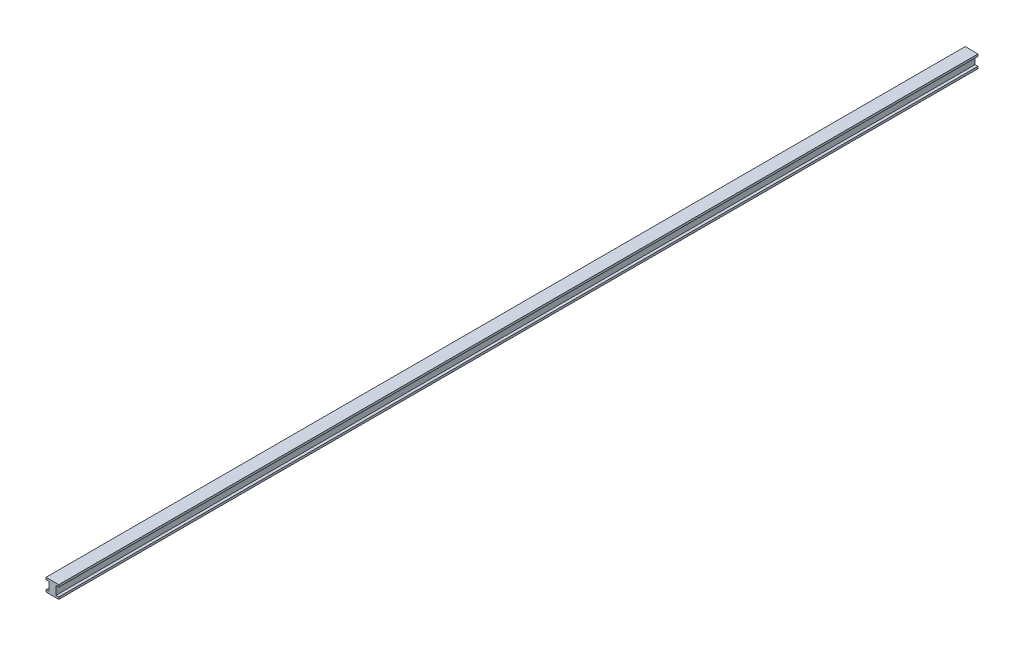
ISO-10303-21;
HEADER;
FILE_DESCRIPTION(('STEP AP214'),'2;1');
FILE_NAME('part.step','',(''),(''),'','','');
FILE_SCHEMA(('AUTOMOTIVE_DESIGN { 1 0 10303 214 1 1 1 1 }'));
ENDSEC;
DATA;
#1=APPLICATION_CONTEXT('core data for automotive mechanical design processes');
#2=APPLICATION_PROTOCOL_DEFINITION('international standard','automotive_design',2000,#1);
#3=PRODUCT_CONTEXT('',#1,'mechanical');
#4=PRODUCT('Part','Part','',(#3));
#5=PRODUCT_RELATED_PRODUCT_CATEGORY('part','',(#4));
#6=PRODUCT_DEFINITION_FORMATION('','',#4);
#7=PRODUCT_DEFINITION_CONTEXT('part definition',#1,'design');
#8=PRODUCT_DEFINITION('design','',#6,#7);
#9=PRODUCT_DEFINITION_SHAPE('','',#8);
#10=(LENGTH_UNIT() NAMED_UNIT(*) SI_UNIT(.MILLI.,.METRE.));
#11=(NAMED_UNIT(*) PLANE_ANGLE_UNIT() SI_UNIT($,.RADIAN.));
#12=(NAMED_UNIT(*) SI_UNIT($,.STERADIAN.) SOLID_ANGLE_UNIT());
#13=UNCERTAINTY_MEASURE_WITH_UNIT(LENGTH_MEASURE(1.E-05),#10,'distance_accuracy_value','');
#14=(GEOMETRIC_REPRESENTATION_CONTEXT(3) GLOBAL_UNCERTAINTY_ASSIGNED_CONTEXT((#13)) GLOBAL_UNIT_ASSIGNED_CONTEXT((#10,
#11,#12)) REPRESENTATION_CONTEXT('',''));
#15=CARTESIAN_POINT('',(0.,0.,0.));
#16=DIRECTION('',(0.,0.,1.));
#17=DIRECTION('',(1.,0.,0.));
#18=AXIS2_PLACEMENT_3D('',#15,#16,#17);
#19=CARTESIAN_POINT('',(-9.,-9.,646.904));
#20=DIRECTION('',(0.,1.,0.));
#21=DIRECTION('',(0.,0.,1.));
#22=AXIS2_PLACEMENT_3D('',#19,#20,#21);
#23=PLANE('',#22);
#24=DIRECTION('',(0.,0.,-1.));
#25=VECTOR('',#24,1.);
#26=CARTESIAN_POINT('',(-9.,-9.,646.904));
#27=LINE('',#26,#25);
#28=CARTESIAN_POINT('',(-9.,-9.,646.904));
#29=VERTEX_POINT('',#28);
#30=CARTESIAN_POINT('',(-9.,-9.,-646.904));
#31=VERTEX_POINT('',#30);
#32=EDGE_CURVE('E138',#29,#31,#27,.T.);
#33=ORIENTED_EDGE('',*,*,#32,.T.);
#34=DIRECTION('',(1.,0.,0.));
#35=VECTOR('',#34,1.);
#36=CARTESIAN_POINT('',(-9.,-9.,-646.904));
#37=LINE('',#36,#35);
#38=CARTESIAN_POINT('',(9.,-9.,-646.904));
#39=VERTEX_POINT('',#38);
#40=EDGE_CURVE('E133',#31,#39,#37,.T.);
#41=ORIENTED_EDGE('',*,*,#40,.T.);
#42=DIRECTION('',(0.,0.,-1.));
#43=VECTOR('',#42,1.);
#44=CARTESIAN_POINT('',(9.,-9.,646.904));
#45=LINE('',#44,#43);
#46=CARTESIAN_POINT('',(9.,-9.,646.904));
#47=VERTEX_POINT('',#46);
#48=EDGE_CURVE('E11',#47,#39,#45,.T.);
#49=ORIENTED_EDGE('',*,*,#48,.F.);
#50=DIRECTION('',(1.,0.,0.));
#51=VECTOR('',#50,1.);
#52=CARTESIAN_POINT('',(-9.,-9.,646.904));
#53=LINE('',#52,#51);
#54=EDGE_CURVE('E169',#29,#47,#53,.T.);
#55=ORIENTED_EDGE('',*,*,#54,.F.);
#56=EDGE_LOOP('',(#33,#41,#49,#55));
#57=FACE_BOUND('',#56,.T.);
#58=ADVANCED_FACE('F33',(#57),#23,.F.);
#59=CARTESIAN_POINT('',(9.,-6.00000000000001,646.904));
#60=DIRECTION('',(-1.,0.,0.));
#61=DIRECTION('',(0.,0.,1.));
#62=AXIS2_PLACEMENT_3D('',#59,#60,#61);
#63=PLANE('',#62);
#64=ORIENTED_EDGE('',*,*,#48,.T.);
#65=DIRECTION('',(0.,1.,0.));
#66=VECTOR('',#65,1.);
#67=CARTESIAN_POINT('',(9.,-6.00000000000001,-646.904));
#68=LINE('',#67,#66);
#69=CARTESIAN_POINT('',(9.,-6.00000000000001,-646.904));
#70=VERTEX_POINT('',#69);
#71=EDGE_CURVE('E123',#39,#70,#68,.T.);
#72=ORIENTED_EDGE('',*,*,#71,.T.);
#73=DIRECTION('',(0.,0.,-1.));
#74=VECTOR('',#73,1.);
#75=CARTESIAN_POINT('',(9.,-6.00000000000001,646.904));
#76=LINE('',#75,#74);
#77=CARTESIAN_POINT('',(9.,-6.00000000000001,646.904));
#78=VERTEX_POINT('',#77);
#79=EDGE_CURVE('E40',#78,#70,#76,.T.);
#80=ORIENTED_EDGE('',*,*,#79,.F.);
#81=DIRECTION('',(0.,1.,0.));
#82=VECTOR('',#81,1.);
#83=CARTESIAN_POINT('',(9.,-6.00000000000001,646.904));
#84=LINE('',#83,#82);
#85=EDGE_CURVE('E124',#47,#78,#84,.T.);
#86=ORIENTED_EDGE('',*,*,#85,.F.);
#87=EDGE_LOOP('',(#64,#72,#80,#86));
#88=FACE_BOUND('',#87,.T.);
#89=ADVANCED_FACE('F121',(#88),#63,.F.);
#90=CARTESIAN_POINT('',(5.,-6.00000000000001,646.904));
#91=DIRECTION('',(0.,-1.,0.));
#92=DIRECTION('',(0.,0.,-1.));
#93=AXIS2_PLACEMENT_3D('',#90,#91,#92);
#94=PLANE('',#93);
#95=ORIENTED_EDGE('',*,*,#79,.T.);
#96=DIRECTION('',(-1.,0.,0.));
#97=VECTOR('',#96,1.);
#98=CARTESIAN_POINT('',(5.,-6.00000000000001,-646.904));
#99=LINE('',#98,#97);
#100=CARTESIAN_POINT('',(5.,-6.00000000000001,-646.904));
#101=VERTEX_POINT('',#100);
#102=EDGE_CURVE('E136',#70,#101,#99,.T.);
#103=ORIENTED_EDGE('',*,*,#102,.T.);
#104=DIRECTION('',(0.,0.,-1.));
#105=VECTOR('',#104,1.);
#106=CARTESIAN_POINT('',(5.,-6.00000000000001,646.904));
#107=LINE('',#106,#105);
#108=CARTESIAN_POINT('',(5.,-6.00000000000001,646.904));
#109=VERTEX_POINT('',#108);
#110=EDGE_CURVE('E207',#109,#101,#107,.T.);
#111=ORIENTED_EDGE('',*,*,#110,.F.);
#112=DIRECTION('',(-1.,0.,0.));
#113=VECTOR('',#112,1.);
#114=CARTESIAN_POINT('',(5.,-6.00000000000001,646.904));
#115=LINE('',#114,#113);
#116=EDGE_CURVE('E172',#78,#109,#115,.T.);
#117=ORIENTED_EDGE('',*,*,#116,.F.);
#118=EDGE_LOOP('',(#95,#103,#111,#117));
#119=FACE_BOUND('',#118,.T.);
#120=ADVANCED_FACE('F210',(#119),#94,.F.);
#121=CARTESIAN_POINT('',(5.,-6.00000000000001,646.904));
#122=DIRECTION('',(-1.,0.,0.));
#123=DIRECTION('',(0.,0.,1.));
#124=AXIS2_PLACEMENT_3D('',#121,#122,#123);
#125=PLANE('',#124);
#126=ORIENTED_EDGE('',*,*,#110,.T.);
#127=DIRECTION('',(0.,1.,0.));
#128=VECTOR('',#127,1.);
#129=CARTESIAN_POINT('',(5.,-6.00000000000001,-646.904));
#130=LINE('',#129,#128);
#131=CARTESIAN_POINT('',(5.,6.00000000000001,-646.904));
#132=VERTEX_POINT('',#131);
#133=EDGE_CURVE('E143',#101,#132,#130,.T.);
#134=ORIENTED_EDGE('',*,*,#133,.T.);
#135=DIRECTION('',(0.,0.,-1.));
#136=VECTOR('',#135,1.);
#137=CARTESIAN_POINT('',(5.,6.00000000000001,646.904));
#138=LINE('',#137,#136);
#139=CARTESIAN_POINT('',(5.,6.00000000000001,646.904));
#140=VERTEX_POINT('',#139);
#141=EDGE_CURVE('E205',#140,#132,#138,.T.);
#142=ORIENTED_EDGE('',*,*,#141,.F.);
#143=DIRECTION('',(0.,1.,0.));
#144=VECTOR('',#143,1.);
#145=CARTESIAN_POINT('',(5.,-6.00000000000001,646.904));
#146=LINE('',#145,#144);
#147=EDGE_CURVE('E174',#109,#140,#146,.T.);
#148=ORIENTED_EDGE('',*,*,#147,.F.);
#149=EDGE_LOOP('',(#126,#134,#142,#148));
#150=FACE_BOUND('',#149,.T.);
#151=ADVANCED_FACE('F218',(#150),#125,.F.);
#152=CARTESIAN_POINT('',(5.,6.00000000000001,646.904));
#153=DIRECTION('',(0.,1.,0.));
#154=DIRECTION('',(0.,0.,1.));
#155=AXIS2_PLACEMENT_3D('',#152,#153,#154);
#156=PLANE('',#155);
#157=ORIENTED_EDGE('',*,*,#141,.T.);
#158=DIRECTION('',(1.,0.,0.));
#159=VECTOR('',#158,1.);
#160=CARTESIAN_POINT('',(5.,6.00000000000001,-646.904));
#161=LINE('',#160,#159);
#162=CARTESIAN_POINT('',(9.,6.00000000000001,-646.904));
#163=VERTEX_POINT('',#162);
#164=EDGE_CURVE('E146',#132,#163,#161,.T.);
#165=ORIENTED_EDGE('',*,*,#164,.T.);
#166=DIRECTION('',(0.,0.,-1.));
#167=VECTOR('',#166,1.);
#168=CARTESIAN_POINT('',(9.,6.00000000000001,646.904));
#169=LINE('',#168,#167);
#170=CARTESIAN_POINT('',(9.,6.00000000000001,646.904));
#171=VERTEX_POINT('',#170);
#172=EDGE_CURVE('E203',#171,#163,#169,.T.);
#173=ORIENTED_EDGE('',*,*,#172,.F.);
#174=DIRECTION('',(1.,0.,0.));
#175=VECTOR('',#174,1.);
#176=CARTESIAN_POINT('',(5.,6.00000000000001,646.904));
#177=LINE('',#176,#175);
#178=EDGE_CURVE('E176',#140,#171,#177,.T.);
#179=ORIENTED_EDGE('',*,*,#178,.F.);
#180=EDGE_LOOP('',(#157,#165,#173,#179));
#181=FACE_BOUND('',#180,.T.);
#182=ADVANCED_FACE('F221',(#181),#156,.F.);
#183=CARTESIAN_POINT('',(9.,6.00000000000001,646.904));
#184=DIRECTION('',(-1.,0.,0.));
#185=DIRECTION('',(0.,0.,1.));
#186=AXIS2_PLACEMENT_3D('',#183,#184,#185);
#187=PLANE('',#186);
#188=ORIENTED_EDGE('',*,*,#172,.T.);
#189=DIRECTION('',(0.,1.,0.));
#190=VECTOR('',#189,1.);
#191=CARTESIAN_POINT('',(9.,6.00000000000001,-646.904));
#192=LINE('',#191,#190);
#193=CARTESIAN_POINT('',(9.,9.,-646.904));
#194=VERTEX_POINT('',#193);
#195=EDGE_CURVE('E149',#163,#194,#192,.T.);
#196=ORIENTED_EDGE('',*,*,#195,.T.);
#197=DIRECTION('',(0.,0.,-1.));
#198=VECTOR('',#197,1.);
#199=CARTESIAN_POINT('',(9.,9.,646.904));
#200=LINE('',#199,#198);
#201=CARTESIAN_POINT('',(9.,9.,646.904));
#202=VERTEX_POINT('',#201);
#203=EDGE_CURVE('E201',#202,#194,#200,.T.);
#204=ORIENTED_EDGE('',*,*,#203,.F.);
#205=DIRECTION('',(0.,1.,0.));
#206=VECTOR('',#205,1.);
#207=CARTESIAN_POINT('',(9.,6.00000000000001,646.904));
#208=LINE('',#207,#206);
#209=EDGE_CURVE('E178',#171,#202,#208,.T.);
#210=ORIENTED_EDGE('',*,*,#209,.F.);
#211=EDGE_LOOP('',(#188,#196,#204,#210));
#212=FACE_BOUND('',#211,.T.);
#213=ADVANCED_FACE('F226',(#212),#187,.F.);
#214=CARTESIAN_POINT('',(-9.,9.,646.904));
#215=DIRECTION('',(0.,-1.,0.));
#216=DIRECTION('',(0.,0.,-1.));
#217=AXIS2_PLACEMENT_3D('',#214,#215,#216);
#218=PLANE('',#217);
#219=ORIENTED_EDGE('',*,*,#203,.T.);
#220=DIRECTION('',(-1.,0.,0.));
#221=VECTOR('',#220,1.);
#222=CARTESIAN_POINT('',(-9.,9.,-646.904));
#223=LINE('',#222,#221);
#224=CARTESIAN_POINT('',(-9.,9.,-646.904));
#225=VERTEX_POINT('',#224);
#226=EDGE_CURVE('E152',#194,#225,#223,.T.);
#227=ORIENTED_EDGE('',*,*,#226,.T.);
#228=DIRECTION('',(0.,0.,-1.));
#229=VECTOR('',#228,1.);
#230=CARTESIAN_POINT('',(-9.,9.,646.904));
#231=LINE('',#230,#229);
#232=CARTESIAN_POINT('',(-9.,9.,646.904));
#233=VERTEX_POINT('',#232);
#234=EDGE_CURVE('E199',#233,#225,#231,.T.);
#235=ORIENTED_EDGE('',*,*,#234,.F.);
#236=DIRECTION('',(-1.,0.,0.));
#237=VECTOR('',#236,1.);
#238=CARTESIAN_POINT('',(-9.,9.,646.904));
#239=LINE('',#238,#237);
#240=EDGE_CURVE('E180',#202,#233,#239,.T.);
#241=ORIENTED_EDGE('',*,*,#240,.F.);
#242=EDGE_LOOP('',(#219,#227,#235,#241));
#243=FACE_BOUND('',#242,.T.);
#244=ADVANCED_FACE('F232',(#243),#218,.F.);
#245=CARTESIAN_POINT('',(-9.,6.00000000000001,646.904));
#246=DIRECTION('',(1.,0.,0.));
#247=DIRECTION('',(0.,0.,-1.));
#248=AXIS2_PLACEMENT_3D('',#245,#246,#247);
#249=PLANE('',#248);
#250=ORIENTED_EDGE('',*,*,#234,.T.);
#251=DIRECTION('',(0.,-1.,0.));
#252=VECTOR('',#251,1.);
#253=CARTESIAN_POINT('',(-9.,6.00000000000001,-646.904));
#254=LINE('',#253,#252);
#255=CARTESIAN_POINT('',(-9.,6.00000000000001,-646.904));
#256=VERTEX_POINT('',#255);
#257=EDGE_CURVE('E155',#225,#256,#254,.T.);
#258=ORIENTED_EDGE('',*,*,#257,.T.);
#259=DIRECTION('',(0.,0.,-1.));
#260=VECTOR('',#259,1.);
#261=CARTESIAN_POINT('',(-9.,6.00000000000001,646.904));
#262=LINE('',#261,#260);
#263=CARTESIAN_POINT('',(-9.,6.00000000000001,646.904));
#264=VERTEX_POINT('',#263);
#265=EDGE_CURVE('E197',#264,#256,#262,.T.);
#266=ORIENTED_EDGE('',*,*,#265,.F.);
#267=DIRECTION('',(0.,-1.,0.));
#268=VECTOR('',#267,1.);
#269=CARTESIAN_POINT('',(-9.,6.00000000000001,646.904));
#270=LINE('',#269,#268);
#271=EDGE_CURVE('E182',#233,#264,#270,.T.);
#272=ORIENTED_EDGE('',*,*,#271,.F.);
#273=EDGE_LOOP('',(#250,#258,#266,#272));
#274=FACE_BOUND('',#273,.T.);
#275=ADVANCED_FACE('F236',(#274),#249,.F.);
#276=CARTESIAN_POINT('',(-5.,6.00000000000001,646.904));
#277=DIRECTION('',(0.,1.,0.));
#278=DIRECTION('',(0.,0.,1.));
#279=AXIS2_PLACEMENT_3D('',#276,#277,#278);
#280=PLANE('',#279);
#281=ORIENTED_EDGE('',*,*,#265,.T.);
#282=DIRECTION('',(1.,0.,0.));
#283=VECTOR('',#282,1.);
#284=CARTESIAN_POINT('',(-5.,6.00000000000001,-646.904));
#285=LINE('',#284,#283);
#286=CARTESIAN_POINT('',(-5.,6.00000000000001,-646.904));
#287=VERTEX_POINT('',#286);
#288=EDGE_CURVE('E158',#256,#287,#285,.T.);
#289=ORIENTED_EDGE('',*,*,#288,.T.);
#290=DIRECTION('',(0.,0.,-1.));
#291=VECTOR('',#290,1.);
#292=CARTESIAN_POINT('',(-5.,6.00000000000001,646.904));
#293=LINE('',#292,#291);
#294=CARTESIAN_POINT('',(-5.,6.00000000000001,646.904));
#295=VERTEX_POINT('',#294);
#296=EDGE_CURVE('E195',#295,#287,#293,.T.);
#297=ORIENTED_EDGE('',*,*,#296,.F.);
#298=DIRECTION('',(1.,0.,0.));
#299=VECTOR('',#298,1.);
#300=CARTESIAN_POINT('',(-5.,6.00000000000001,646.904));
#301=LINE('',#300,#299);
#302=EDGE_CURVE('E184',#264,#295,#301,.T.);
#303=ORIENTED_EDGE('',*,*,#302,.F.);
#304=EDGE_LOOP('',(#281,#289,#297,#303));
#305=FACE_BOUND('',#304,.T.);
#306=ADVANCED_FACE('F241',(#305),#280,.F.);
#307=CARTESIAN_POINT('',(-5.,-6.00000000000001,646.904));
#308=DIRECTION('',(1.,0.,0.));
#309=DIRECTION('',(0.,0.,-1.));
#310=AXIS2_PLACEMENT_3D('',#307,#308,#309);
#311=PLANE('',#310);
#312=ORIENTED_EDGE('',*,*,#296,.T.);
#313=DIRECTION('',(0.,-1.,0.));
#314=VECTOR('',#313,1.);
#315=CARTESIAN_POINT('',(-5.,-6.00000000000001,-646.904));
#316=LINE('',#315,#314);
#317=CARTESIAN_POINT('',(-5.,-6.00000000000001,-646.904));
#318=VERTEX_POINT('',#317);
#319=EDGE_CURVE('E161',#287,#318,#316,.T.);
#320=ORIENTED_EDGE('',*,*,#319,.T.);
#321=DIRECTION('',(0.,0.,-1.));
#322=VECTOR('',#321,1.);
#323=CARTESIAN_POINT('',(-5.,-6.00000000000001,646.904));
#324=LINE('',#323,#322);
#325=CARTESIAN_POINT('',(-5.,-6.00000000000001,646.904));
#326=VERTEX_POINT('',#325);
#327=EDGE_CURVE('E193',#326,#318,#324,.T.);
#328=ORIENTED_EDGE('',*,*,#327,.F.);
#329=DIRECTION('',(0.,-1.,0.));
#330=VECTOR('',#329,1.);
#331=CARTESIAN_POINT('',(-5.,-6.00000000000001,646.904));
#332=LINE('',#331,#330);
#333=EDGE_CURVE('E186',#295,#326,#332,.T.);
#334=ORIENTED_EDGE('',*,*,#333,.F.);
#335=EDGE_LOOP('',(#312,#320,#328,#334));
#336=FACE_BOUND('',#335,.T.);
#337=ADVANCED_FACE('F245',(#336),#311,.F.);
#338=CARTESIAN_POINT('',(-5.,-6.00000000000001,646.904));
#339=DIRECTION('',(0.,-1.,0.));
#340=DIRECTION('',(0.,0.,-1.));
#341=AXIS2_PLACEMENT_3D('',#338,#339,#340);
#342=PLANE('',#341);
#343=ORIENTED_EDGE('',*,*,#327,.T.);
#344=DIRECTION('',(-1.,0.,0.));
#345=VECTOR('',#344,1.);
#346=CARTESIAN_POINT('',(-5.,-6.00000000000001,-646.904));
#347=LINE('',#346,#345);
#348=CARTESIAN_POINT('',(-9.,-6.00000000000001,-646.904));
#349=VERTEX_POINT('',#348);
#350=EDGE_CURVE('E164',#318,#349,#347,.T.);
#351=ORIENTED_EDGE('',*,*,#350,.T.);
#352=DIRECTION('',(0.,0.,-1.));
#353=VECTOR('',#352,1.);
#354=CARTESIAN_POINT('',(-9.,-6.00000000000001,646.904));
#355=LINE('',#354,#353);
#356=CARTESIAN_POINT('',(-9.,-6.00000000000001,646.904));
#357=VERTEX_POINT('',#356);
#358=EDGE_CURVE('E191',#357,#349,#355,.T.);
#359=ORIENTED_EDGE('',*,*,#358,.F.);
#360=DIRECTION('',(-1.,0.,0.));
#361=VECTOR('',#360,1.);
#362=CARTESIAN_POINT('',(-5.,-6.00000000000001,646.904));
#363=LINE('',#362,#361);
#364=EDGE_CURVE('E52',#326,#357,#363,.T.);
#365=ORIENTED_EDGE('',*,*,#364,.F.);
#366=EDGE_LOOP('',(#343,#351,#359,#365));
#367=FACE_BOUND('',#366,.T.);
#368=ADVANCED_FACE('F249',(#367),#342,.F.);
#369=CARTESIAN_POINT('',(-9.,-6.00000000000001,646.904));
#370=DIRECTION('',(1.,0.,0.));
#371=DIRECTION('',(0.,0.,-1.));
#372=AXIS2_PLACEMENT_3D('',#369,#370,#371);
#373=PLANE('',#372);
#374=ORIENTED_EDGE('',*,*,#358,.T.);
#375=DIRECTION('',(0.,-1.,0.));
#376=VECTOR('',#375,1.);
#377=CARTESIAN_POINT('',(-9.,-6.00000000000001,-646.904));
#378=LINE('',#377,#376);
#379=EDGE_CURVE('E167',#349,#31,#378,.T.);
#380=ORIENTED_EDGE('',*,*,#379,.T.);
#381=ORIENTED_EDGE('',*,*,#32,.F.);
#382=DIRECTION('',(0.,-1.,0.));
#383=VECTOR('',#382,1.);
#384=CARTESIAN_POINT('',(-9.,-6.00000000000001,646.904));
#385=LINE('',#384,#383);
#386=EDGE_CURVE('E47',#357,#29,#385,.T.);
#387=ORIENTED_EDGE('',*,*,#386,.F.);
#388=EDGE_LOOP('',(#374,#380,#381,#387));
#389=FACE_BOUND('',#388,.T.);
#390=ADVANCED_FACE('F251',(#389),#373,.F.);
#391=CARTESIAN_POINT('',(0.,0.,646.904));
#392=DIRECTION('',(0.,0.,-1.));
#393=DIRECTION('',(-1.,0.,0.));
#394=AXIS2_PLACEMENT_3D('',#391,#392,#393);
#395=PLANE('',#394);
#396=ORIENTED_EDGE('',*,*,#54,.T.);
#397=ORIENTED_EDGE('',*,*,#85,.T.);
#398=ORIENTED_EDGE('',*,*,#116,.T.);
#399=ORIENTED_EDGE('',*,*,#147,.T.);
#400=ORIENTED_EDGE('',*,*,#178,.T.);
#401=ORIENTED_EDGE('',*,*,#209,.T.);
#402=ORIENTED_EDGE('',*,*,#240,.T.);
#403=ORIENTED_EDGE('',*,*,#271,.T.);
#404=ORIENTED_EDGE('',*,*,#302,.T.);
#405=ORIENTED_EDGE('',*,*,#333,.T.);
#406=ORIENTED_EDGE('',*,*,#364,.T.);
#407=ORIENTED_EDGE('',*,*,#386,.T.);
#408=EDGE_LOOP('',(#396,#397,#398,#399,#400,#401,#402,#403,#404,#405,#406,#407));
#409=FACE_BOUND('',#408,.T.);
#410=ADVANCED_FACE('F213',(#409),#395,.F.);
#411=CARTESIAN_POINT('',(0.,0.,-646.904));
#412=DIRECTION('',(0.,0.,1.));
#413=DIRECTION('',(-1.,0.,0.));
#414=AXIS2_PLACEMENT_3D('',#411,#412,#413);
#415=PLANE('',#414);
#416=ORIENTED_EDGE('',*,*,#40,.F.);
#417=ORIENTED_EDGE('',*,*,#379,.F.);
#418=ORIENTED_EDGE('',*,*,#350,.F.);
#419=ORIENTED_EDGE('',*,*,#319,.F.);
#420=ORIENTED_EDGE('',*,*,#288,.F.);
#421=ORIENTED_EDGE('',*,*,#257,.F.);
#422=ORIENTED_EDGE('',*,*,#226,.F.);
#423=ORIENTED_EDGE('',*,*,#195,.F.);
#424=ORIENTED_EDGE('',*,*,#164,.F.);
#425=ORIENTED_EDGE('',*,*,#133,.F.);
#426=ORIENTED_EDGE('',*,*,#102,.F.);
#427=ORIENTED_EDGE('',*,*,#71,.F.);
#428=EDGE_LOOP('',(#416,#417,#418,#419,#420,#421,#422,#423,#424,#425,#426,#427));
#429=FACE_BOUND('',#428,.T.);
#430=ADVANCED_FACE('F131',(#429),#415,.F.);
#431=CLOSED_SHELL('',(#58,#89,#120,#151,#182,#213,#244,#275,#306,#337,#368,#390,#410,#430));
#432=MANIFOLD_SOLID_BREP('B2',#431);
#433=ADVANCED_BREP_SHAPE_REPRESENTATION('',(#18,#432),#14);
#434=SHAPE_DEFINITION_REPRESENTATION(#9,#433);
ENDSEC;
END-ISO-10303-21;
